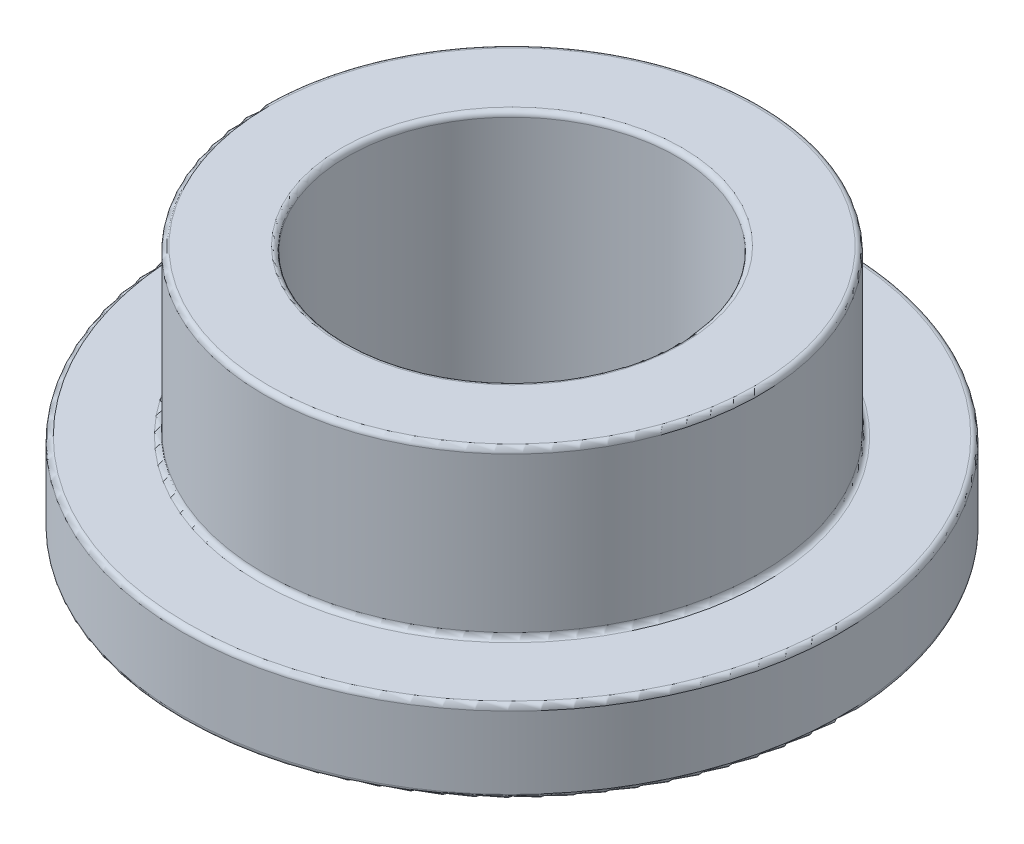
ISO-10303-21;
HEADER;
FILE_DESCRIPTION(('STEP AP214'),'2;1');
FILE_NAME('part.step','',(''),(''),'','','');
FILE_SCHEMA(('AUTOMOTIVE_DESIGN { 1 0 10303 214 1 1 1 1 }'));
ENDSEC;
DATA;
#1=APPLICATION_CONTEXT('core data for automotive mechanical design processes');
#2=APPLICATION_PROTOCOL_DEFINITION('international standard','automotive_design',2000,#1);
#3=PRODUCT_CONTEXT('',#1,'mechanical');
#4=PRODUCT('Part','Part','',(#3));
#5=PRODUCT_RELATED_PRODUCT_CATEGORY('part','',(#4));
#6=PRODUCT_DEFINITION_FORMATION('','',#4);
#7=PRODUCT_DEFINITION_CONTEXT('part definition',#1,'design');
#8=PRODUCT_DEFINITION('design','',#6,#7);
#9=PRODUCT_DEFINITION_SHAPE('','',#8);
#10=(LENGTH_UNIT() NAMED_UNIT(*) SI_UNIT(.MILLI.,.METRE.));
#11=(NAMED_UNIT(*) PLANE_ANGLE_UNIT() SI_UNIT($,.RADIAN.));
#12=(NAMED_UNIT(*) SI_UNIT($,.STERADIAN.) SOLID_ANGLE_UNIT());
#13=UNCERTAINTY_MEASURE_WITH_UNIT(LENGTH_MEASURE(1.E-05),#10,'distance_accuracy_value','');
#14=(GEOMETRIC_REPRESENTATION_CONTEXT(3) GLOBAL_UNCERTAINTY_ASSIGNED_CONTEXT((#13)) GLOBAL_UNIT_ASSIGNED_CONTEXT((#10,
#11,#12)) REPRESENTATION_CONTEXT('',''));
#15=CARTESIAN_POINT('',(0.,0.,0.));
#16=DIRECTION('',(0.,0.,1.));
#17=DIRECTION('',(1.,0.,0.));
#18=AXIS2_PLACEMENT_3D('',#15,#16,#17);
#19=CARTESIAN_POINT('',(0.,6.,0.));
#20=DIRECTION('',(0.,1.,0.));
#21=DIRECTION('',(0.,0.,1.));
#22=AXIS2_PLACEMENT_3D('',#19,#20,#21);
#23=PLANE('',#22);
#24=CARTESIAN_POINT('',(0.,6.,0.));
#25=DIRECTION('',(0.,1.,0.));
#26=DIRECTION('',(0.,0.,1.));
#27=AXIS2_PLACEMENT_3D('',#24,#25,#26);
#28=CIRCLE('',#27,4.13);
#29=CARTESIAN_POINT('',(0.,6.,4.13));
#30=VERTEX_POINT('',#29);
#31=EDGE_CURVE('E10',#30,#30,#28,.F.);
#32=ORIENTED_EDGE('',*,*,#31,.T.);
#33=EDGE_LOOP('',(#32));
#34=FACE_BOUND('',#33,.T.);
#35=CARTESIAN_POINT('',(0.,6.,0.));
#36=DIRECTION('',(0.,1.,0.));
#37=DIRECTION('',(0.,0.,1.));
#38=AXIS2_PLACEMENT_3D('',#35,#36,#37);
#39=CIRCLE('',#38,5.89);
#40=CARTESIAN_POINT('',(0.,6.,5.89));
#41=VERTEX_POINT('',#40);
#42=EDGE_CURVE('E37',#41,#41,#39,.T.);
#43=ORIENTED_EDGE('',*,*,#42,.T.);
#44=EDGE_LOOP('',(#43));
#45=FACE_BOUND('',#44,.T.);
#46=ADVANCED_FACE('F30',(#34,#45),#23,.T.);
#47=CARTESIAN_POINT('',(0.,0.,0.));
#48=DIRECTION('',(0.,1.,0.));
#49=DIRECTION('',(0.,0.,1.));
#50=AXIS2_PLACEMENT_3D('',#47,#48,#49);
#51=PLANE('',#50);
#52=CARTESIAN_POINT('',(0.,0.,0.));
#53=DIRECTION('',(0.,1.,0.));
#54=DIRECTION('',(0.,0.,1.));
#55=AXIS2_PLACEMENT_3D('',#52,#53,#54);
#56=CIRCLE('',#55,4.13);
#57=CARTESIAN_POINT('',(0.,0.,4.13));
#58=VERTEX_POINT('',#57);
#59=EDGE_CURVE('E68',#58,#58,#56,.T.);
#60=ORIENTED_EDGE('',*,*,#59,.T.);
#61=EDGE_LOOP('',(#60));
#62=FACE_BOUND('',#61,.T.);
#63=CARTESIAN_POINT('',(0.,0.,0.));
#64=DIRECTION('',(0.,1.,0.));
#65=DIRECTION('',(0.,0.,1.));
#66=AXIS2_PLACEMENT_3D('',#63,#64,#65);
#67=CIRCLE('',#66,7.875);
#68=CARTESIAN_POINT('',(0.,0.,7.875));
#69=VERTEX_POINT('',#68);
#70=EDGE_CURVE('E71',#69,#69,#67,.F.);
#71=ORIENTED_EDGE('',*,*,#70,.T.);
#72=EDGE_LOOP('',(#71));
#73=FACE_BOUND('',#72,.T.);
#74=ADVANCED_FACE('F75',(#62,#73),#51,.F.);
#75=CARTESIAN_POINT('',(0.,6.,0.));
#76=DIRECTION('',(0.,-1.,0.));
#77=DIRECTION('',(0.,0.,-1.));
#78=AXIS2_PLACEMENT_3D('',#75,#76,#77);
#79=CYLINDRICAL_SURFACE('',#78,6.015);
#80=CARTESIAN_POINT('',(0.,2.125,0.));
#81=DIRECTION('',(0.,1.,0.));
#82=DIRECTION('',(0.,0.,1.));
#83=AXIS2_PLACEMENT_3D('',#80,#81,#82);
#84=CIRCLE('',#83,6.015);
#85=CARTESIAN_POINT('',(0.,2.125,6.015));
#86=VERTEX_POINT('',#85);
#87=EDGE_CURVE('E50',#86,#86,#84,.T.);
#88=ORIENTED_EDGE('',*,*,#87,.T.);
#89=EDGE_LOOP('',(#88));
#90=FACE_BOUND('',#89,.T.);
#91=CARTESIAN_POINT('',(0.,5.875,0.));
#92=DIRECTION('',(0.,1.,0.));
#93=DIRECTION('',(0.,0.,1.));
#94=AXIS2_PLACEMENT_3D('',#91,#92,#93);
#95=CIRCLE('',#94,6.015);
#96=CARTESIAN_POINT('',(0.,5.875,6.015));
#97=VERTEX_POINT('',#96);
#98=EDGE_CURVE('E53',#97,#97,#95,.F.);
#99=ORIENTED_EDGE('',*,*,#98,.T.);
#100=EDGE_LOOP('',(#99));
#101=FACE_BOUND('',#100,.T.);
#102=ADVANCED_FACE('F106',(#90,#101),#79,.T.);
#103=CARTESIAN_POINT('',(0.,6.,0.));
#104=DIRECTION('',(0.,-1.,0.));
#105=DIRECTION('',(0.,0.,-1.));
#106=AXIS2_PLACEMENT_3D('',#103,#104,#105);
#107=CYLINDRICAL_SURFACE('',#106,4.005);
#108=CARTESIAN_POINT('',(0.,0.125,0.));
#109=DIRECTION('',(0.,1.,0.));
#110=DIRECTION('',(0.,0.,1.));
#111=AXIS2_PLACEMENT_3D('',#108,#109,#110);
#112=CIRCLE('',#111,4.005);
#113=CARTESIAN_POINT('',(0.,0.125,4.005));
#114=VERTEX_POINT('',#113);
#115=EDGE_CURVE('E62',#114,#114,#112,.F.);
#116=ORIENTED_EDGE('',*,*,#115,.T.);
#117=EDGE_LOOP('',(#116));
#118=FACE_BOUND('',#117,.T.);
#119=CARTESIAN_POINT('',(0.,5.875,0.));
#120=DIRECTION('',(0.,1.,0.));
#121=DIRECTION('',(0.,0.,1.));
#122=AXIS2_PLACEMENT_3D('',#119,#120,#121);
#123=CIRCLE('',#122,4.005);
#124=CARTESIAN_POINT('',(0.,5.875,4.005));
#125=VERTEX_POINT('',#124);
#126=EDGE_CURVE('E65',#125,#125,#123,.T.);
#127=ORIENTED_EDGE('',*,*,#126,.T.);
#128=EDGE_LOOP('',(#127));
#129=FACE_BOUND('',#128,.T.);
#130=ADVANCED_FACE('F100',(#118,#129),#107,.F.);
#131=CARTESIAN_POINT('',(0.,2.,0.));
#132=DIRECTION('',(0.,1.,0.));
#133=DIRECTION('',(0.,0.,1.));
#134=AXIS2_PLACEMENT_3D('',#131,#132,#133);
#135=PLANE('',#134);
#136=CARTESIAN_POINT('',(0.,2.,0.));
#137=DIRECTION('',(0.,1.,0.));
#138=DIRECTION('',(0.,0.,1.));
#139=AXIS2_PLACEMENT_3D('',#136,#137,#138);
#140=CIRCLE('',#139,6.14);
#141=CARTESIAN_POINT('',(0.,2.,6.14));
#142=VERTEX_POINT('',#141);
#143=EDGE_CURVE('E41',#142,#142,#140,.F.);
#144=ORIENTED_EDGE('',*,*,#143,.T.);
#145=EDGE_LOOP('',(#144));
#146=FACE_BOUND('',#145,.T.);
#147=CARTESIAN_POINT('',(0.,2.,0.));
#148=DIRECTION('',(0.,1.,0.));
#149=DIRECTION('',(0.,0.,1.));
#150=AXIS2_PLACEMENT_3D('',#147,#148,#149);
#151=CIRCLE('',#150,7.875);
#152=CARTESIAN_POINT('',(0.,2.,7.875));
#153=VERTEX_POINT('',#152);
#154=EDGE_CURVE('E45',#153,#153,#151,.T.);
#155=ORIENTED_EDGE('',*,*,#154,.T.);
#156=EDGE_LOOP('',(#155));
#157=FACE_BOUND('',#156,.T.);
#158=ADVANCED_FACE('F88',(#146,#157),#135,.T.);
#159=CARTESIAN_POINT('',(0.,2.,0.));
#160=DIRECTION('',(0.,-1.,0.));
#161=DIRECTION('',(0.,0.,-1.));
#162=AXIS2_PLACEMENT_3D('',#159,#160,#161);
#163=CYLINDRICAL_SURFACE('',#162,8.);
#164=CARTESIAN_POINT('',(0.,0.125,0.));
#165=DIRECTION('',(0.,1.,0.));
#166=DIRECTION('',(0.,0.,1.));
#167=AXIS2_PLACEMENT_3D('',#164,#165,#166);
#168=CIRCLE('',#167,8.);
#169=CARTESIAN_POINT('',(0.,0.125,8.));
#170=VERTEX_POINT('',#169);
#171=EDGE_CURVE('E56',#170,#170,#168,.T.);
#172=ORIENTED_EDGE('',*,*,#171,.T.);
#173=EDGE_LOOP('',(#172));
#174=FACE_BOUND('',#173,.T.);
#175=CARTESIAN_POINT('',(0.,1.875,0.));
#176=DIRECTION('',(0.,1.,0.));
#177=DIRECTION('',(0.,0.,1.));
#178=AXIS2_PLACEMENT_3D('',#175,#176,#177);
#179=CIRCLE('',#178,8.);
#180=CARTESIAN_POINT('',(0.,1.875,8.));
#181=VERTEX_POINT('',#180);
#182=EDGE_CURVE('E59',#181,#181,#179,.F.);
#183=ORIENTED_EDGE('',*,*,#182,.T.);
#184=EDGE_LOOP('',(#183));
#185=FACE_BOUND('',#184,.T.);
#186=ADVANCED_FACE('F85',(#174,#185),#163,.T.);
#187=CARTESIAN_POINT('',(0.,0.125,0.));
#188=DIRECTION('',(0.,1.,0.));
#189=DIRECTION('',(0.,0.,1.));
#190=AXIS2_PLACEMENT_3D('',#187,#188,#189);
#191=TOROIDAL_SURFACE('',#190,4.13,0.125);
#192=ORIENTED_EDGE('',*,*,#115,.F.);
#193=EDGE_LOOP('',(#192));
#194=FACE_BOUND('',#193,.T.);
#195=ORIENTED_EDGE('',*,*,#59,.F.);
#196=EDGE_LOOP('',(#195));
#197=FACE_BOUND('',#196,.T.);
#198=ADVANCED_FACE('F81',(#194,#197),#191,.T.);
#199=CARTESIAN_POINT('',(0.,0.125,0.));
#200=DIRECTION('',(0.,1.,0.));
#201=DIRECTION('',(0.,0.,1.));
#202=AXIS2_PLACEMENT_3D('',#199,#200,#201);
#203=TOROIDAL_SURFACE('',#202,7.875,0.125);
#204=ORIENTED_EDGE('',*,*,#70,.F.);
#205=EDGE_LOOP('',(#204));
#206=FACE_BOUND('',#205,.T.);
#207=ORIENTED_EDGE('',*,*,#171,.F.);
#208=EDGE_LOOP('',(#207));
#209=FACE_BOUND('',#208,.T.);
#210=ADVANCED_FACE('F77',(#206,#209),#203,.T.);
#211=CARTESIAN_POINT('',(0.,2.125,0.));
#212=DIRECTION('',(0.,1.,0.));
#213=DIRECTION('',(0.,0.,1.));
#214=AXIS2_PLACEMENT_3D('',#211,#212,#213);
#215=TOROIDAL_SURFACE('',#214,6.14,0.125);
#216=ORIENTED_EDGE('',*,*,#143,.F.);
#217=EDGE_LOOP('',(#216));
#218=FACE_BOUND('',#217,.T.);
#219=ORIENTED_EDGE('',*,*,#87,.F.);
#220=EDGE_LOOP('',(#219));
#221=FACE_BOUND('',#220,.T.);
#222=ADVANCED_FACE('F80',(#218,#221),#215,.F.);
#223=CARTESIAN_POINT('',(0.,1.875,0.));
#224=DIRECTION('',(0.,1.,0.));
#225=DIRECTION('',(0.,0.,1.));
#226=AXIS2_PLACEMENT_3D('',#223,#224,#225);
#227=TOROIDAL_SURFACE('',#226,7.875,0.125);
#228=ORIENTED_EDGE('',*,*,#182,.F.);
#229=EDGE_LOOP('',(#228));
#230=FACE_BOUND('',#229,.T.);
#231=ORIENTED_EDGE('',*,*,#154,.F.);
#232=EDGE_LOOP('',(#231));
#233=FACE_BOUND('',#232,.T.);
#234=ADVANCED_FACE('F92',(#230,#233),#227,.T.);
#235=CARTESIAN_POINT('',(0.,5.875,0.));
#236=DIRECTION('',(0.,1.,0.));
#237=DIRECTION('',(0.,0.,1.));
#238=AXIS2_PLACEMENT_3D('',#235,#236,#237);
#239=TOROIDAL_SURFACE('',#238,4.13,0.125);
#240=ORIENTED_EDGE('',*,*,#31,.F.);
#241=EDGE_LOOP('',(#240));
#242=FACE_BOUND('',#241,.T.);
#243=ORIENTED_EDGE('',*,*,#126,.F.);
#244=EDGE_LOOP('',(#243));
#245=FACE_BOUND('',#244,.T.);
#246=ADVANCED_FACE('F95',(#242,#245),#239,.T.);
#247=CARTESIAN_POINT('',(0.,5.875,0.));
#248=DIRECTION('',(0.,1.,0.));
#249=DIRECTION('',(0.,0.,1.));
#250=AXIS2_PLACEMENT_3D('',#247,#248,#249);
#251=TOROIDAL_SURFACE('',#250,5.89,0.125);
#252=ORIENTED_EDGE('',*,*,#98,.F.);
#253=EDGE_LOOP('',(#252));
#254=FACE_BOUND('',#253,.T.);
#255=ORIENTED_EDGE('',*,*,#42,.F.);
#256=EDGE_LOOP('',(#255));
#257=FACE_BOUND('',#256,.T.);
#258=ADVANCED_FACE('F32',(#254,#257),#251,.T.);
#259=CLOSED_SHELL('',(#46,#74,#102,#130,#158,#186,#198,#210,#222,#234,#246,#258));
#260=MANIFOLD_SOLID_BREP('B2',#259);
#261=ADVANCED_BREP_SHAPE_REPRESENTATION('',(#18,#260),#14);
#262=SHAPE_DEFINITION_REPRESENTATION(#9,#261);
ENDSEC;
END-ISO-10303-21;
